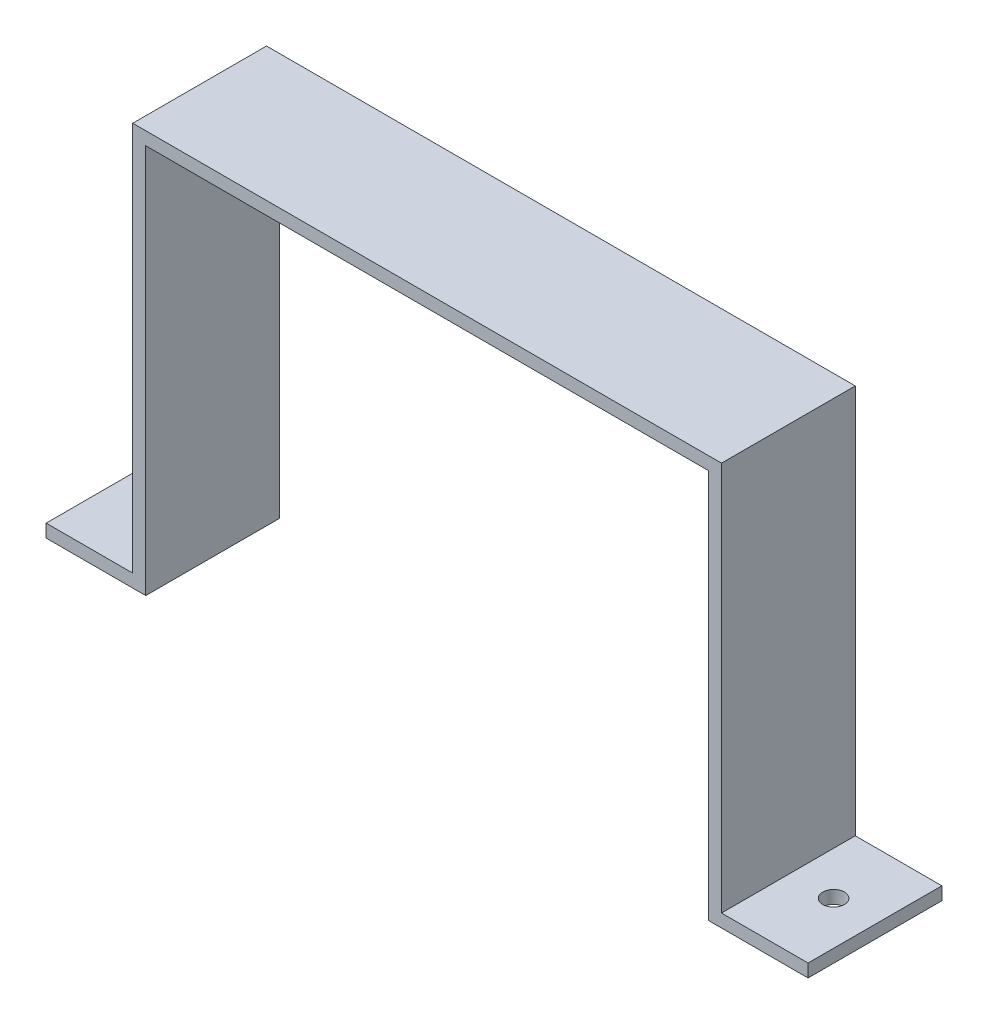
ISO-10303-21;
HEADER;
FILE_DESCRIPTION(('STEP AP214'),'2;1');
FILE_NAME('part.step','',(''),(''),'','','');
FILE_SCHEMA(('AUTOMOTIVE_DESIGN { 1 0 10303 214 1 1 1 1 }'));
ENDSEC;
DATA;
#1=APPLICATION_CONTEXT('core data for automotive mechanical design processes');
#2=APPLICATION_PROTOCOL_DEFINITION('international standard','automotive_design',2000,#1);
#3=PRODUCT_CONTEXT('',#1,'mechanical');
#4=PRODUCT('Part','Part','',(#3));
#5=PRODUCT_RELATED_PRODUCT_CATEGORY('part','',(#4));
#6=PRODUCT_DEFINITION_FORMATION('','',#4);
#7=PRODUCT_DEFINITION_CONTEXT('part definition',#1,'design');
#8=PRODUCT_DEFINITION('design','',#6,#7);
#9=PRODUCT_DEFINITION_SHAPE('','',#8);
#10=(LENGTH_UNIT() NAMED_UNIT(*) SI_UNIT(.MILLI.,.METRE.));
#11=(NAMED_UNIT(*) PLANE_ANGLE_UNIT() SI_UNIT($,.RADIAN.));
#12=(NAMED_UNIT(*) SI_UNIT($,.STERADIAN.) SOLID_ANGLE_UNIT());
#13=UNCERTAINTY_MEASURE_WITH_UNIT(LENGTH_MEASURE(1.E-05),#10,'distance_accuracy_value','');
#14=(GEOMETRIC_REPRESENTATION_CONTEXT(3) GLOBAL_UNCERTAINTY_ASSIGNED_CONTEXT((#13)) GLOBAL_UNIT_ASSIGNED_CONTEXT((#10,
#11,#12)) REPRESENTATION_CONTEXT('',''));
#15=CARTESIAN_POINT('',(0.,0.,0.));
#16=DIRECTION('',(0.,0.,1.));
#17=DIRECTION('',(1.,0.,0.));
#18=AXIS2_PLACEMENT_3D('',#15,#16,#17);
#19=CARTESIAN_POINT('',(0.,-87.,30.9));
#20=DIRECTION('',(0.,-1.,0.));
#21=DIRECTION('',(0.,0.,-1.));
#22=AXIS2_PLACEMENT_3D('',#19,#20,#21);
#23=PLANE('',#22);
#24=CARTESIAN_POINT('',(-9.99999999999999,-87.,15.));
#25=DIRECTION('',(0.,1.,0.));
#26=DIRECTION('',(0.,0.,1.));
#27=AXIS2_PLACEMENT_3D('',#24,#25,#26);
#28=CIRCLE('',#27,2.5);
#29=CARTESIAN_POINT('',(-9.99999999999999,-87.,17.5));
#30=VERTEX_POINT('',#29);
#31=EDGE_CURVE('E301',#30,#30,#28,.T.);
#32=ORIENTED_EDGE('',*,*,#31,.F.);
#33=EDGE_LOOP('',(#32));
#34=FACE_BOUND('',#33,.T.);
#35=DIRECTION('',(-1.,0.,0.));
#36=VECTOR('',#35,1.);
#37=CARTESIAN_POINT('',(0.,-87.,0.));
#38=LINE('',#37,#36);
#39=CARTESIAN_POINT('',(0.,-87.,0.));
#40=VERTEX_POINT('',#39);
#41=CARTESIAN_POINT('',(-20.,-87.,0.));
#42=VERTEX_POINT('',#41);
#43=EDGE_CURVE('E168',#40,#42,#38,.T.);
#44=ORIENTED_EDGE('',*,*,#43,.T.);
#45=DIRECTION('',(0.,0.,-1.));
#46=VECTOR('',#45,1.);
#47=CARTESIAN_POINT('',(-20.,-87.,30.9));
#48=LINE('',#47,#46);
#49=CARTESIAN_POINT('',(-20.,-87.,30.9));
#50=VERTEX_POINT('',#49);
#51=EDGE_CURVE('E48',#50,#42,#48,.T.);
#52=ORIENTED_EDGE('',*,*,#51,.F.);
#53=DIRECTION('',(-1.,0.,0.));
#54=VECTOR('',#53,1.);
#55=CARTESIAN_POINT('',(0.,-87.,30.9));
#56=LINE('',#55,#54);
#57=CARTESIAN_POINT('',(0.,-87.,30.9));
#58=VERTEX_POINT('',#57);
#59=EDGE_CURVE('E111',#58,#50,#56,.T.);
#60=ORIENTED_EDGE('',*,*,#59,.F.);
#61=DIRECTION('',(0.,0.,-1.));
#62=VECTOR('',#61,1.);
#63=CARTESIAN_POINT('',(0.,-87.,30.9));
#64=LINE('',#63,#62);
#65=EDGE_CURVE('E11',#58,#40,#64,.T.);
#66=ORIENTED_EDGE('',*,*,#65,.T.);
#67=EDGE_LOOP('',(#44,#52,#60,#66));
#68=FACE_BOUND('',#67,.T.);
#69=ADVANCED_FACE('F39',(#34,#68),#23,.F.);
#70=CARTESIAN_POINT('',(-20.,-90.,30.9));
#71=DIRECTION('',(1.,0.,0.));
#72=DIRECTION('',(0.,0.,-1.));
#73=AXIS2_PLACEMENT_3D('',#70,#71,#72);
#74=PLANE('',#73);
#75=DIRECTION('',(0.,-1.,0.));
#76=VECTOR('',#75,1.);
#77=CARTESIAN_POINT('',(-20.,-90.,0.));
#78=LINE('',#77,#76);
#79=CARTESIAN_POINT('',(-20.,-90.,0.));
#80=VERTEX_POINT('',#79);
#81=EDGE_CURVE('E171',#42,#80,#78,.T.);
#82=ORIENTED_EDGE('',*,*,#81,.T.);
#83=DIRECTION('',(0.,0.,-1.));
#84=VECTOR('',#83,1.);
#85=CARTESIAN_POINT('',(-20.,-90.,30.9));
#86=LINE('',#85,#84);
#87=CARTESIAN_POINT('',(-20.,-90.,30.9));
#88=VERTEX_POINT('',#87);
#89=EDGE_CURVE('E230',#88,#80,#86,.T.);
#90=ORIENTED_EDGE('',*,*,#89,.F.);
#91=DIRECTION('',(0.,-1.,0.));
#92=VECTOR('',#91,1.);
#93=CARTESIAN_POINT('',(-20.,-90.,30.9));
#94=LINE('',#93,#92);
#95=EDGE_CURVE('E240',#50,#88,#94,.T.);
#96=ORIENTED_EDGE('',*,*,#95,.F.);
#97=ORIENTED_EDGE('',*,*,#51,.T.);
#98=EDGE_LOOP('',(#82,#90,#96,#97));
#99=FACE_BOUND('',#98,.T.);
#100=ADVANCED_FACE('F238',(#99),#74,.F.);
#101=CARTESIAN_POINT('',(0.,-90.,30.9));
#102=DIRECTION('',(0.,1.,0.));
#103=DIRECTION('',(0.,0.,1.));
#104=AXIS2_PLACEMENT_3D('',#101,#102,#103);
#105=PLANE('',#104);
#106=CARTESIAN_POINT('',(-9.99999999999999,-90.,15.));
#107=DIRECTION('',(0.,1.,0.));
#108=DIRECTION('',(0.,0.,1.));
#109=AXIS2_PLACEMENT_3D('',#106,#107,#108);
#110=CIRCLE('',#109,2.5);
#111=CARTESIAN_POINT('',(-9.99999999999999,-90.,17.5));
#112=VERTEX_POINT('',#111);
#113=EDGE_CURVE('E297',#112,#112,#110,.T.);
#114=ORIENTED_EDGE('',*,*,#113,.T.);
#115=EDGE_LOOP('',(#114));
#116=FACE_BOUND('',#115,.T.);
#117=DIRECTION('',(1.,0.,0.));
#118=VECTOR('',#117,1.);
#119=CARTESIAN_POINT('',(0.,-90.,0.));
#120=LINE('',#119,#118);
#121=CARTESIAN_POINT('',(3.00000000000001,-90.,0.));
#122=VERTEX_POINT('',#121);
#123=EDGE_CURVE('E176',#80,#122,#120,.T.);
#124=ORIENTED_EDGE('',*,*,#123,.T.);
#125=DIRECTION('',(0.,0.,-1.));
#126=VECTOR('',#125,1.);
#127=CARTESIAN_POINT('',(3.00000000000001,-90.,30.9));
#128=LINE('',#127,#126);
#129=CARTESIAN_POINT('',(3.00000000000001,-90.,30.9));
#130=VERTEX_POINT('',#129);
#131=EDGE_CURVE('E226',#130,#122,#128,.T.);
#132=ORIENTED_EDGE('',*,*,#131,.F.);
#133=DIRECTION('',(1.,0.,0.));
#134=VECTOR('',#133,1.);
#135=CARTESIAN_POINT('',(0.,-90.,30.9));
#136=LINE('',#135,#134);
#137=EDGE_CURVE('E259',#88,#130,#136,.T.);
#138=ORIENTED_EDGE('',*,*,#137,.F.);
#139=ORIENTED_EDGE('',*,*,#89,.T.);
#140=EDGE_LOOP('',(#124,#132,#138,#139));
#141=FACE_BOUND('',#140,.T.);
#142=ADVANCED_FACE('F249',(#116,#141),#105,.F.);
#143=CARTESIAN_POINT('',(3.,0.,30.9));
#144=DIRECTION('',(-1.,0.,0.));
#145=DIRECTION('',(0.,-1.,0.));
#146=AXIS2_PLACEMENT_3D('',#143,#144,#145);
#147=PLANE('',#146);
#148=DIRECTION('',(0.,1.,0.));
#149=VECTOR('',#148,1.);
#150=CARTESIAN_POINT('',(3.,0.,0.));
#151=LINE('',#150,#149);
#152=CARTESIAN_POINT('',(3.,0.,0.));
#153=VERTEX_POINT('',#152);
#154=EDGE_CURVE('E179',#122,#153,#151,.T.);
#155=ORIENTED_EDGE('',*,*,#154,.T.);
#156=DIRECTION('',(0.,0.,-1.));
#157=VECTOR('',#156,1.);
#158=CARTESIAN_POINT('',(3.,0.,30.9));
#159=LINE('',#158,#157);
#160=CARTESIAN_POINT('',(3.,0.,30.9));
#161=VERTEX_POINT('',#160);
#162=EDGE_CURVE('E222',#161,#153,#159,.T.);
#163=ORIENTED_EDGE('',*,*,#162,.F.);
#164=DIRECTION('',(0.,1.,0.));
#165=VECTOR('',#164,1.);
#166=CARTESIAN_POINT('',(3.,0.,30.9));
#167=LINE('',#166,#165);
#168=EDGE_CURVE('E255',#130,#161,#167,.T.);
#169=ORIENTED_EDGE('',*,*,#168,.F.);
#170=ORIENTED_EDGE('',*,*,#131,.T.);
#171=EDGE_LOOP('',(#155,#163,#169,#170));
#172=FACE_BOUND('',#171,.T.);
#173=ADVANCED_FACE('F253',(#172),#147,.F.);
#174=CARTESIAN_POINT('',(3.,0.,30.9));
#175=DIRECTION('',(0.,1.,0.));
#176=DIRECTION('',(-1.,0.,0.));
#177=AXIS2_PLACEMENT_3D('',#174,#175,#176);
#178=PLANE('',#177);
#179=DIRECTION('',(1.,0.,0.));
#180=VECTOR('',#179,1.);
#181=CARTESIAN_POINT('',(3.,0.,0.));
#182=LINE('',#181,#180);
#183=CARTESIAN_POINT('',(133.,0.,0.));
#184=VERTEX_POINT('',#183);
#185=EDGE_CURVE('E182',#153,#184,#182,.T.);
#186=ORIENTED_EDGE('',*,*,#185,.T.);
#187=DIRECTION('',(0.,0.,-1.));
#188=VECTOR('',#187,1.);
#189=CARTESIAN_POINT('',(133.,0.,30.9));
#190=LINE('',#189,#188);
#191=CARTESIAN_POINT('',(133.,0.,30.9));
#192=VERTEX_POINT('',#191);
#193=EDGE_CURVE('E218',#192,#184,#190,.T.);
#194=ORIENTED_EDGE('',*,*,#193,.F.);
#195=DIRECTION('',(1.,0.,0.));
#196=VECTOR('',#195,1.);
#197=CARTESIAN_POINT('',(3.,0.,30.9));
#198=LINE('',#197,#196);
#199=EDGE_CURVE('E258',#161,#192,#198,.T.);
#200=ORIENTED_EDGE('',*,*,#199,.F.);
#201=ORIENTED_EDGE('',*,*,#162,.T.);
#202=EDGE_LOOP('',(#186,#194,#200,#201));
#203=FACE_BOUND('',#202,.T.);
#204=ADVANCED_FACE('F320',(#203),#178,.F.);
#205=CARTESIAN_POINT('',(133.,0.,30.9));
#206=DIRECTION('',(1.,0.,0.));
#207=DIRECTION('',(0.,0.,-1.));
#208=AXIS2_PLACEMENT_3D('',#205,#206,#207);
#209=PLANE('',#208);
#210=DIRECTION('',(0.,-1.,0.));
#211=VECTOR('',#210,1.);
#212=CARTESIAN_POINT('',(133.,0.,0.));
#213=LINE('',#212,#211);
#214=CARTESIAN_POINT('',(133.,-90.,0.));
#215=VERTEX_POINT('',#214);
#216=EDGE_CURVE('E185',#184,#215,#213,.T.);
#217=ORIENTED_EDGE('',*,*,#216,.T.);
#218=DIRECTION('',(0.,0.,-1.));
#219=VECTOR('',#218,1.);
#220=CARTESIAN_POINT('',(133.,-90.,30.9));
#221=LINE('',#220,#219);
#222=CARTESIAN_POINT('',(133.,-90.,30.9));
#223=VERTEX_POINT('',#222);
#224=EDGE_CURVE('E214',#223,#215,#221,.T.);
#225=ORIENTED_EDGE('',*,*,#224,.F.);
#226=DIRECTION('',(0.,-1.,0.));
#227=VECTOR('',#226,1.);
#228=CARTESIAN_POINT('',(133.,0.,30.9));
#229=LINE('',#228,#227);
#230=EDGE_CURVE('E263',#192,#223,#229,.T.);
#231=ORIENTED_EDGE('',*,*,#230,.F.);
#232=ORIENTED_EDGE('',*,*,#193,.T.);
#233=EDGE_LOOP('',(#217,#225,#231,#232));
#234=FACE_BOUND('',#233,.T.);
#235=ADVANCED_FACE('F323',(#234),#209,.F.);
#236=CARTESIAN_POINT('',(136.,-90.,30.9));
#237=DIRECTION('',(0.,1.,0.));
#238=DIRECTION('',(0.,0.,1.));
#239=AXIS2_PLACEMENT_3D('',#236,#237,#238);
#240=PLANE('',#239);
#241=CARTESIAN_POINT('',(146.,-90.,15.));
#242=DIRECTION('',(0.,1.,0.));
#243=DIRECTION('',(0.,0.,1.));
#244=AXIS2_PLACEMENT_3D('',#241,#242,#243);
#245=CIRCLE('',#244,2.5);
#246=CARTESIAN_POINT('',(146.,-90.,17.5));
#247=VERTEX_POINT('',#246);
#248=EDGE_CURVE('E172',#247,#247,#245,.T.);
#249=ORIENTED_EDGE('',*,*,#248,.T.);
#250=EDGE_LOOP('',(#249));
#251=FACE_BOUND('',#250,.T.);
#252=DIRECTION('',(1.,0.,0.));
#253=VECTOR('',#252,1.);
#254=CARTESIAN_POINT('',(136.,-90.,0.));
#255=LINE('',#254,#253);
#256=CARTESIAN_POINT('',(156.,-90.,0.));
#257=VERTEX_POINT('',#256);
#258=EDGE_CURVE('E189',#215,#257,#255,.T.);
#259=ORIENTED_EDGE('',*,*,#258,.T.);
#260=DIRECTION('',(0.,0.,-1.));
#261=VECTOR('',#260,1.);
#262=CARTESIAN_POINT('',(156.,-90.,30.9));
#263=LINE('',#262,#261);
#264=CARTESIAN_POINT('',(156.,-90.,30.9));
#265=VERTEX_POINT('',#264);
#266=EDGE_CURVE('E210',#265,#257,#263,.T.);
#267=ORIENTED_EDGE('',*,*,#266,.F.);
#268=DIRECTION('',(1.,0.,0.));
#269=VECTOR('',#268,1.);
#270=CARTESIAN_POINT('',(136.,-90.,30.9));
#271=LINE('',#270,#269);
#272=EDGE_CURVE('E270',#223,#265,#271,.T.);
#273=ORIENTED_EDGE('',*,*,#272,.F.);
#274=ORIENTED_EDGE('',*,*,#224,.T.);
#275=EDGE_LOOP('',(#259,#267,#273,#274));
#276=FACE_BOUND('',#275,.T.);
#277=ADVANCED_FACE('F278',(#251,#276),#240,.F.);
#278=CARTESIAN_POINT('',(156.,-90.,30.9));
#279=DIRECTION('',(-1.,0.,0.));
#280=DIRECTION('',(0.,0.,1.));
#281=AXIS2_PLACEMENT_3D('',#278,#279,#280);
#282=PLANE('',#281);
#283=DIRECTION('',(0.,1.,0.));
#284=VECTOR('',#283,1.);
#285=CARTESIAN_POINT('',(156.,-90.,0.));
#286=LINE('',#285,#284);
#287=CARTESIAN_POINT('',(156.,-87.,0.));
#288=VERTEX_POINT('',#287);
#289=EDGE_CURVE('E192',#257,#288,#286,.T.);
#290=ORIENTED_EDGE('',*,*,#289,.T.);
#291=DIRECTION('',(0.,0.,-1.));
#292=VECTOR('',#291,1.);
#293=CARTESIAN_POINT('',(156.,-87.,30.9));
#294=LINE('',#293,#292);
#295=CARTESIAN_POINT('',(156.,-87.,30.9));
#296=VERTEX_POINT('',#295);
#297=EDGE_CURVE('E155',#296,#288,#294,.T.);
#298=ORIENTED_EDGE('',*,*,#297,.F.);
#299=DIRECTION('',(0.,1.,0.));
#300=VECTOR('',#299,1.);
#301=CARTESIAN_POINT('',(156.,-90.,30.9));
#302=LINE('',#301,#300);
#303=EDGE_CURVE('E143',#265,#296,#302,.T.);
#304=ORIENTED_EDGE('',*,*,#303,.F.);
#305=ORIENTED_EDGE('',*,*,#266,.T.);
#306=EDGE_LOOP('',(#290,#298,#304,#305));
#307=FACE_BOUND('',#306,.T.);
#308=ADVANCED_FACE('F281',(#307),#282,.F.);
#309=CARTESIAN_POINT('',(136.,-87.,30.9));
#310=DIRECTION('',(0.,-1.,0.));
#311=DIRECTION('',(0.,0.,-1.));
#312=AXIS2_PLACEMENT_3D('',#309,#310,#311);
#313=PLANE('',#312);
#314=CARTESIAN_POINT('',(146.,-87.,15.));
#315=DIRECTION('',(0.,1.,0.));
#316=DIRECTION('',(0.,0.,1.));
#317=AXIS2_PLACEMENT_3D('',#314,#315,#316);
#318=CIRCLE('',#317,2.5);
#319=CARTESIAN_POINT('',(146.,-87.,17.5));
#320=VERTEX_POINT('',#319);
#321=EDGE_CURVE('E293',#320,#320,#318,.T.);
#322=ORIENTED_EDGE('',*,*,#321,.F.);
#323=EDGE_LOOP('',(#322));
#324=FACE_BOUND('',#323,.T.);
#325=DIRECTION('',(-1.,0.,0.));
#326=VECTOR('',#325,1.);
#327=CARTESIAN_POINT('',(136.,-87.,0.));
#328=LINE('',#327,#326);
#329=CARTESIAN_POINT('',(136.,-87.,0.));
#330=VERTEX_POINT('',#329);
#331=EDGE_CURVE('E153',#288,#330,#328,.T.);
#332=ORIENTED_EDGE('',*,*,#331,.T.);
#333=DIRECTION('',(0.,0.,-1.));
#334=VECTOR('',#333,1.);
#335=CARTESIAN_POINT('',(136.,-87.,30.9));
#336=LINE('',#335,#334);
#337=CARTESIAN_POINT('',(136.,-87.,30.9));
#338=VERTEX_POINT('',#337);
#339=EDGE_CURVE('E150',#338,#330,#336,.T.);
#340=ORIENTED_EDGE('',*,*,#339,.F.);
#341=DIRECTION('',(-1.,0.,0.));
#342=VECTOR('',#341,1.);
#343=CARTESIAN_POINT('',(136.,-87.,30.9));
#344=LINE('',#343,#342);
#345=EDGE_CURVE('E137',#296,#338,#344,.T.);
#346=ORIENTED_EDGE('',*,*,#345,.F.);
#347=ORIENTED_EDGE('',*,*,#297,.T.);
#348=EDGE_LOOP('',(#332,#340,#346,#347));
#349=FACE_BOUND('',#348,.T.);
#350=ADVANCED_FACE('F151',(#324,#349),#313,.F.);
#351=CARTESIAN_POINT('',(136.,0.,30.9));
#352=DIRECTION('',(-1.,0.,0.));
#353=DIRECTION('',(0.,0.,1.));
#354=AXIS2_PLACEMENT_3D('',#351,#352,#353);
#355=PLANE('',#354);
#356=DIRECTION('',(0.,1.,0.));
#357=VECTOR('',#356,1.);
#358=CARTESIAN_POINT('',(136.,0.,0.));
#359=LINE('',#358,#357);
#360=CARTESIAN_POINT('',(136.,3.,0.));
#361=VERTEX_POINT('',#360);
#362=EDGE_CURVE('E97',#330,#361,#359,.T.);
#363=ORIENTED_EDGE('',*,*,#362,.T.);
#364=DIRECTION('',(0.,0.,-1.));
#365=VECTOR('',#364,1.);
#366=CARTESIAN_POINT('',(136.,3.,30.9));
#367=LINE('',#366,#365);
#368=CARTESIAN_POINT('',(136.,3.,30.9));
#369=VERTEX_POINT('',#368);
#370=EDGE_CURVE('E156',#369,#361,#367,.T.);
#371=ORIENTED_EDGE('',*,*,#370,.F.);
#372=DIRECTION('',(0.,1.,0.));
#373=VECTOR('',#372,1.);
#374=CARTESIAN_POINT('',(136.,0.,30.9));
#375=LINE('',#374,#373);
#376=EDGE_CURVE('E141',#338,#369,#375,.T.);
#377=ORIENTED_EDGE('',*,*,#376,.F.);
#378=ORIENTED_EDGE('',*,*,#339,.T.);
#379=EDGE_LOOP('',(#363,#371,#377,#378));
#380=FACE_BOUND('',#379,.T.);
#381=ADVANCED_FACE('F158',(#380),#355,.F.);
#382=CARTESIAN_POINT('',(0.,3.,30.9));
#383=DIRECTION('',(0.,-1.,0.));
#384=DIRECTION('',(0.,0.,-1.));
#385=AXIS2_PLACEMENT_3D('',#382,#383,#384);
#386=PLANE('',#385);
#387=DIRECTION('',(-1.,0.,0.));
#388=VECTOR('',#387,1.);
#389=CARTESIAN_POINT('',(0.,3.,0.));
#390=LINE('',#389,#388);
#391=CARTESIAN_POINT('',(0.,3.,0.));
#392=VERTEX_POINT('',#391);
#393=EDGE_CURVE('E104',#361,#392,#390,.T.);
#394=ORIENTED_EDGE('',*,*,#393,.T.);
#395=DIRECTION('',(0.,0.,-1.));
#396=VECTOR('',#395,1.);
#397=CARTESIAN_POINT('',(0.,3.,30.9));
#398=LINE('',#397,#396);
#399=CARTESIAN_POINT('',(0.,3.,30.9));
#400=VERTEX_POINT('',#399);
#401=EDGE_CURVE('E164',#400,#392,#398,.T.);
#402=ORIENTED_EDGE('',*,*,#401,.F.);
#403=DIRECTION('',(-1.,0.,0.));
#404=VECTOR('',#403,1.);
#405=CARTESIAN_POINT('',(0.,3.,30.9));
#406=LINE('',#405,#404);
#407=EDGE_CURVE('E161',#369,#400,#406,.T.);
#408=ORIENTED_EDGE('',*,*,#407,.F.);
#409=ORIENTED_EDGE('',*,*,#370,.T.);
#410=EDGE_LOOP('',(#394,#402,#408,#409));
#411=FACE_BOUND('',#410,.T.);
#412=ADVANCED_FACE('F283',(#411),#386,.F.);
#413=CARTESIAN_POINT('',(0.,0.,30.9));
#414=DIRECTION('',(1.,0.,0.));
#415=DIRECTION('',(0.,0.,-1.));
#416=AXIS2_PLACEMENT_3D('',#413,#414,#415);
#417=PLANE('',#416);
#418=DIRECTION('',(0.,-1.,0.));
#419=VECTOR('',#418,1.);
#420=CARTESIAN_POINT('',(0.,0.,0.));
#421=LINE('',#420,#419);
#422=EDGE_CURVE('E201',#392,#40,#421,.T.);
#423=ORIENTED_EDGE('',*,*,#422,.T.);
#424=ORIENTED_EDGE('',*,*,#65,.F.);
#425=DIRECTION('',(0.,-1.,0.));
#426=VECTOR('',#425,1.);
#427=CARTESIAN_POINT('',(0.,0.,30.9));
#428=LINE('',#427,#426);
#429=EDGE_CURVE('E56',#400,#58,#428,.T.);
#430=ORIENTED_EDGE('',*,*,#429,.F.);
#431=ORIENTED_EDGE('',*,*,#401,.T.);
#432=EDGE_LOOP('',(#423,#424,#430,#431));
#433=FACE_BOUND('',#432,.T.);
#434=ADVANCED_FACE('F282',(#433),#417,.F.);
#435=CARTESIAN_POINT('',(0.,0.,30.9));
#436=DIRECTION('',(0.,0.,-1.));
#437=DIRECTION('',(-1.,0.,0.));
#438=AXIS2_PLACEMENT_3D('',#435,#436,#437);
#439=PLANE('',#438);
#440=ORIENTED_EDGE('',*,*,#429,.T.);
#441=ORIENTED_EDGE('',*,*,#59,.T.);
#442=ORIENTED_EDGE('',*,*,#95,.T.);
#443=ORIENTED_EDGE('',*,*,#137,.T.);
#444=ORIENTED_EDGE('',*,*,#168,.T.);
#445=ORIENTED_EDGE('',*,*,#199,.T.);
#446=ORIENTED_EDGE('',*,*,#230,.T.);
#447=ORIENTED_EDGE('',*,*,#272,.T.);
#448=ORIENTED_EDGE('',*,*,#303,.T.);
#449=ORIENTED_EDGE('',*,*,#345,.T.);
#450=ORIENTED_EDGE('',*,*,#376,.T.);
#451=ORIENTED_EDGE('',*,*,#407,.T.);
#452=EDGE_LOOP('',(#440,#441,#442,#443,#444,#445,#446,#447,#448,#449,#450,#451));
#453=FACE_BOUND('',#452,.T.);
#454=ADVANCED_FACE('F139',(#453),#439,.F.);
#455=CARTESIAN_POINT('',(0.,0.,0.));
#456=DIRECTION('',(0.,0.,-1.));
#457=DIRECTION('',(-1.,0.,0.));
#458=AXIS2_PLACEMENT_3D('',#455,#456,#457);
#459=PLANE('',#458);
#460=ORIENTED_EDGE('',*,*,#43,.F.);
#461=ORIENTED_EDGE('',*,*,#422,.F.);
#462=ORIENTED_EDGE('',*,*,#393,.F.);
#463=ORIENTED_EDGE('',*,*,#362,.F.);
#464=ORIENTED_EDGE('',*,*,#331,.F.);
#465=ORIENTED_EDGE('',*,*,#289,.F.);
#466=ORIENTED_EDGE('',*,*,#258,.F.);
#467=ORIENTED_EDGE('',*,*,#216,.F.);
#468=ORIENTED_EDGE('',*,*,#185,.F.);
#469=ORIENTED_EDGE('',*,*,#154,.F.);
#470=ORIENTED_EDGE('',*,*,#123,.F.);
#471=ORIENTED_EDGE('',*,*,#81,.F.);
#472=EDGE_LOOP('',(#460,#461,#462,#463,#464,#465,#466,#467,#468,#469,#470,#471));
#473=FACE_BOUND('',#472,.T.);
#474=ADVANCED_FACE('F243',(#473),#459,.T.);
#475=CARTESIAN_POINT('',(146.,-87.,15.));
#476=DIRECTION('',(0.,1.,0.));
#477=DIRECTION('',(0.,0.,1.));
#478=AXIS2_PLACEMENT_3D('',#475,#476,#477);
#479=CYLINDRICAL_SURFACE('',#478,2.5);
#480=ORIENTED_EDGE('',*,*,#248,.F.);
#481=EDGE_LOOP('',(#480));
#482=FACE_BOUND('',#481,.T.);
#483=ORIENTED_EDGE('',*,*,#321,.T.);
#484=EDGE_LOOP('',(#483));
#485=FACE_BOUND('',#484,.T.);
#486=ADVANCED_FACE('F344',(#482,#485),#479,.F.);
#487=CARTESIAN_POINT('',(-9.99999999999999,-87.,15.));
#488=DIRECTION('',(0.,1.,0.));
#489=DIRECTION('',(0.,0.,1.));
#490=AXIS2_PLACEMENT_3D('',#487,#488,#489);
#491=CYLINDRICAL_SURFACE('',#490,2.5);
#492=ORIENTED_EDGE('',*,*,#113,.F.);
#493=EDGE_LOOP('',(#492));
#494=FACE_BOUND('',#493,.T.);
#495=ORIENTED_EDGE('',*,*,#31,.T.);
#496=EDGE_LOOP('',(#495));
#497=FACE_BOUND('',#496,.T.);
#498=ADVANCED_FACE('F306',(#494,#497),#491,.F.);
#499=CLOSED_SHELL('',(#69,#100,#142,#173,#204,#235,#277,#308,#350,#381,#412,#434,#454,#474,#486,#498));
#500=MANIFOLD_SOLID_BREP('B2',#499);
#501=ADVANCED_BREP_SHAPE_REPRESENTATION('',(#18,#500),#14);
#502=SHAPE_DEFINITION_REPRESENTATION(#9,#501);
ENDSEC;
END-ISO-10303-21;
